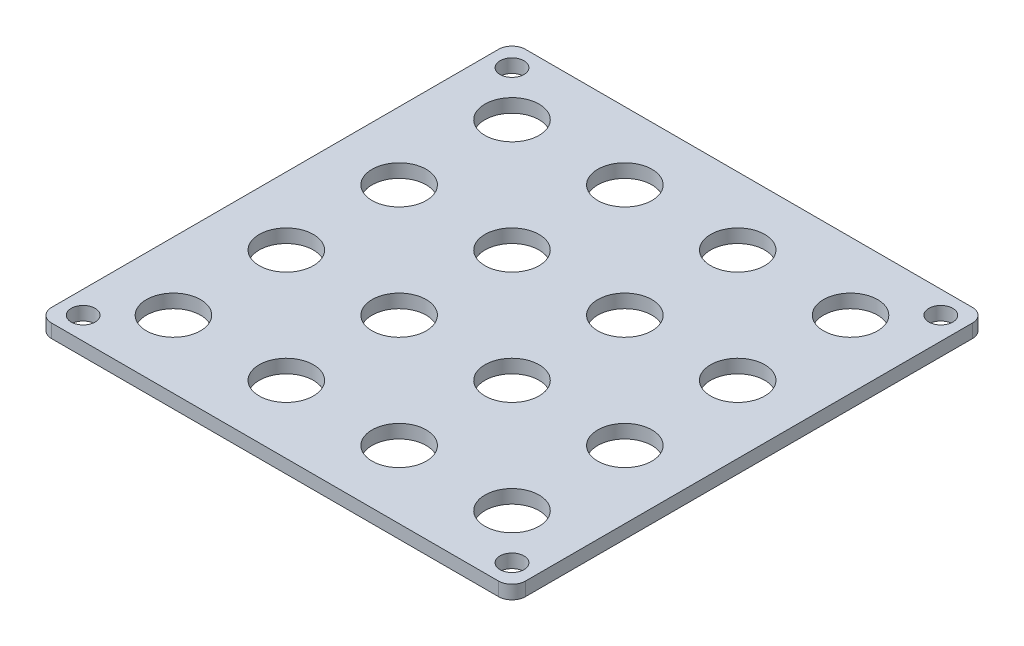
ISO-10303-21;
HEADER;
FILE_DESCRIPTION(('STEP AP214'),'2;1');
FILE_NAME('part.step','',(''),(''),'','','');
FILE_SCHEMA(('AUTOMOTIVE_DESIGN { 1 0 10303 214 1 1 1 1 }'));
ENDSEC;
DATA;
#1=APPLICATION_CONTEXT('core data for automotive mechanical design processes');
#2=APPLICATION_PROTOCOL_DEFINITION('international standard','automotive_design',2000,#1);
#3=PRODUCT_CONTEXT('',#1,'mechanical');
#4=PRODUCT('Part','Part','',(#3));
#5=PRODUCT_RELATED_PRODUCT_CATEGORY('part','',(#4));
#6=PRODUCT_DEFINITION_FORMATION('','',#4);
#7=PRODUCT_DEFINITION_CONTEXT('part definition',#1,'design');
#8=PRODUCT_DEFINITION('design','',#6,#7);
#9=PRODUCT_DEFINITION_SHAPE('','',#8);
#10=(LENGTH_UNIT() NAMED_UNIT(*) SI_UNIT(.MILLI.,.METRE.));
#11=(NAMED_UNIT(*) PLANE_ANGLE_UNIT() SI_UNIT($,.RADIAN.));
#12=(NAMED_UNIT(*) SI_UNIT($,.STERADIAN.) SOLID_ANGLE_UNIT());
#13=UNCERTAINTY_MEASURE_WITH_UNIT(LENGTH_MEASURE(1.E-05),#10,'distance_accuracy_value','');
#14=(GEOMETRIC_REPRESENTATION_CONTEXT(3) GLOBAL_UNCERTAINTY_ASSIGNED_CONTEXT((#13)) GLOBAL_UNIT_ASSIGNED_CONTEXT((#10,
#11,#12)) REPRESENTATION_CONTEXT('',''));
#15=CARTESIAN_POINT('',(0.,0.,0.));
#16=DIRECTION('',(0.,0.,1.));
#17=DIRECTION('',(1.,0.,0.));
#18=AXIS2_PLACEMENT_3D('',#15,#16,#17);
#19=CARTESIAN_POINT('',(0.,3.,0.));
#20=DIRECTION('',(0.,1.,0.));
#21=DIRECTION('',(0.,0.,1.));
#22=AXIS2_PLACEMENT_3D('',#19,#20,#21);
#23=PLANE('',#22);
#24=CARTESIAN_POINT('',(-10.,3.,-10.));
#25=DIRECTION('',(0.,1.,0.));
#26=DIRECTION('',(0.,0.,1.));
#27=AXIS2_PLACEMENT_3D('',#24,#25,#26);
#28=CIRCLE('',#27,2.64999999999999);
#29=CARTESIAN_POINT('',(-10.,3.,-7.35000000000001));
#30=VERTEX_POINT('',#29);
#31=EDGE_CURVE('E296',#30,#30,#28,.T.);
#32=ORIENTED_EDGE('',*,*,#31,.F.);
#33=EDGE_LOOP('',(#32));
#34=FACE_BOUND('',#33,.T.);
#35=CARTESIAN_POINT('',(-10.,3.,85.));
#36=DIRECTION('',(0.,1.,0.));
#37=DIRECTION('',(0.,0.,1.));
#38=AXIS2_PLACEMENT_3D('',#35,#36,#37);
#39=CIRCLE('',#38,2.64999999999999);
#40=CARTESIAN_POINT('',(-10.,3.,87.65));
#41=VERTEX_POINT('',#40);
#42=EDGE_CURVE('E290',#41,#41,#39,.T.);
#43=ORIENTED_EDGE('',*,*,#42,.F.);
#44=EDGE_LOOP('',(#43));
#45=FACE_BOUND('',#44,.T.);
#46=CARTESIAN_POINT('',(85.,3.,85.));
#47=DIRECTION('',(0.,1.,0.));
#48=DIRECTION('',(0.,0.,1.));
#49=AXIS2_PLACEMENT_3D('',#46,#47,#48);
#50=CIRCLE('',#49,2.64999999999999);
#51=CARTESIAN_POINT('',(85.,3.,87.65));
#52=VERTEX_POINT('',#51);
#53=EDGE_CURVE('E284',#52,#52,#50,.T.);
#54=ORIENTED_EDGE('',*,*,#53,.F.);
#55=EDGE_LOOP('',(#54));
#56=FACE_BOUND('',#55,.T.);
#57=CARTESIAN_POINT('',(85.,3.,-10.));
#58=DIRECTION('',(0.,1.,0.));
#59=DIRECTION('',(0.,0.,1.));
#60=AXIS2_PLACEMENT_3D('',#57,#58,#59);
#61=CIRCLE('',#60,2.64999999999999);
#62=CARTESIAN_POINT('',(85.,3.,-7.35000000000001));
#63=VERTEX_POINT('',#62);
#64=EDGE_CURVE('E278',#63,#63,#61,.T.);
#65=ORIENTED_EDGE('',*,*,#64,.F.);
#66=EDGE_LOOP('',(#65));
#67=FACE_BOUND('',#66,.T.);
#68=CARTESIAN_POINT('',(25.,3.,75.));
#69=DIRECTION('',(0.,1.,0.));
#70=DIRECTION('',(0.,0.,1.));
#71=AXIS2_PLACEMENT_3D('',#68,#69,#70);
#72=CIRCLE('',#71,6.);
#73=CARTESIAN_POINT('',(25.,3.,81.));
#74=VERTEX_POINT('',#73);
#75=EDGE_CURVE('E261',#74,#74,#72,.T.);
#76=ORIENTED_EDGE('',*,*,#75,.F.);
#77=EDGE_LOOP('',(#76));
#78=FACE_BOUND('',#77,.T.);
#79=CARTESIAN_POINT('',(0.,3.,75.));
#80=DIRECTION('',(0.,1.,0.));
#81=DIRECTION('',(0.,0.,1.));
#82=AXIS2_PLACEMENT_3D('',#79,#80,#81);
#83=CIRCLE('',#82,6.);
#84=CARTESIAN_POINT('',(0.,3.,81.));
#85=VERTEX_POINT('',#84);
#86=EDGE_CURVE('E249',#85,#85,#83,.T.);
#87=ORIENTED_EDGE('',*,*,#86,.F.);
#88=EDGE_LOOP('',(#87));
#89=FACE_BOUND('',#88,.T.);
#90=CARTESIAN_POINT('',(0.,3.,25.));
#91=DIRECTION('',(0.,1.,0.));
#92=DIRECTION('',(0.,0.,1.));
#93=AXIS2_PLACEMENT_3D('',#90,#91,#92);
#94=CIRCLE('',#93,6.);
#95=CARTESIAN_POINT('',(0.,3.,31.));
#96=VERTEX_POINT('',#95);
#97=EDGE_CURVE('E237',#96,#96,#94,.T.);
#98=ORIENTED_EDGE('',*,*,#97,.F.);
#99=EDGE_LOOP('',(#98));
#100=FACE_BOUND('',#99,.T.);
#101=CARTESIAN_POINT('',(50.,3.,50.));
#102=DIRECTION('',(0.,1.,0.));
#103=DIRECTION('',(0.,0.,1.));
#104=AXIS2_PLACEMENT_3D('',#101,#102,#103);
#105=CIRCLE('',#104,6.);
#106=CARTESIAN_POINT('',(50.,3.,56.));
#107=VERTEX_POINT('',#106);
#108=EDGE_CURVE('E225',#107,#107,#105,.T.);
#109=ORIENTED_EDGE('',*,*,#108,.F.);
#110=EDGE_LOOP('',(#109));
#111=FACE_BOUND('',#110,.T.);
#112=CARTESIAN_POINT('',(75.,3.,25.));
#113=DIRECTION('',(0.,1.,0.));
#114=DIRECTION('',(0.,0.,1.));
#115=AXIS2_PLACEMENT_3D('',#112,#113,#114);
#116=CIRCLE('',#115,6.);
#117=CARTESIAN_POINT('',(75.,3.,31.));
#118=VERTEX_POINT('',#117);
#119=EDGE_CURVE('E213',#118,#118,#116,.T.);
#120=ORIENTED_EDGE('',*,*,#119,.F.);
#121=EDGE_LOOP('',(#120));
#122=FACE_BOUND('',#121,.T.);
#123=CARTESIAN_POINT('',(25.,3.,25.));
#124=DIRECTION('',(0.,1.,0.));
#125=DIRECTION('',(0.,0.,1.));
#126=AXIS2_PLACEMENT_3D('',#123,#124,#125);
#127=CIRCLE('',#126,6.);
#128=CARTESIAN_POINT('',(25.,3.,31.));
#129=VERTEX_POINT('',#128);
#130=EDGE_CURVE('E201',#129,#129,#127,.T.);
#131=ORIENTED_EDGE('',*,*,#130,.F.);
#132=EDGE_LOOP('',(#131));
#133=FACE_BOUND('',#132,.T.);
#134=CARTESIAN_POINT('',(50.,3.,0.));
#135=DIRECTION('',(0.,1.,0.));
#136=DIRECTION('',(0.,0.,1.));
#137=AXIS2_PLACEMENT_3D('',#134,#135,#136);
#138=CIRCLE('',#137,6.);
#139=CARTESIAN_POINT('',(50.,3.,6.));
#140=VERTEX_POINT('',#139);
#141=EDGE_CURVE('E189',#140,#140,#138,.T.);
#142=ORIENTED_EDGE('',*,*,#141,.F.);
#143=EDGE_LOOP('',(#142));
#144=FACE_BOUND('',#143,.T.);
#145=CARTESIAN_POINT('',(0.,3.,0.));
#146=DIRECTION('',(0.,1.,0.));
#147=DIRECTION('',(0.,0.,1.));
#148=AXIS2_PLACEMENT_3D('',#145,#146,#147);
#149=CIRCLE('',#148,6.);
#150=CARTESIAN_POINT('',(0.,3.,6.));
#151=VERTEX_POINT('',#150);
#152=EDGE_CURVE('E130',#151,#151,#149,.T.);
#153=ORIENTED_EDGE('',*,*,#152,.F.);
#154=EDGE_LOOP('',(#153));
#155=FACE_BOUND('',#154,.T.);
#156=DIRECTION('',(-1.,0.,0.));
#157=VECTOR('',#156,1.);
#158=CARTESIAN_POINT('',(90.,3.,-15.));
#159=LINE('',#158,#157);
#160=CARTESIAN_POINT('',(87.,3.,-15.));
#161=VERTEX_POINT('',#160);
#162=CARTESIAN_POINT('',(-12.,3.,-15.));
#163=VERTEX_POINT('',#162);
#164=EDGE_CURVE('E139',#161,#163,#159,.T.);
#165=ORIENTED_EDGE('',*,*,#164,.T.);
#166=CARTESIAN_POINT('',(-12.,3.,-12.));
#167=DIRECTION('',(0.,1.,0.));
#168=DIRECTION('',(0.,0.,1.));
#169=AXIS2_PLACEMENT_3D('',#166,#167,#168);
#170=CIRCLE('',#169,3.);
#171=CARTESIAN_POINT('',(-15.,3.,-12.));
#172=VERTEX_POINT('',#171);
#173=EDGE_CURVE('E158',#163,#172,#170,.T.);
#174=ORIENTED_EDGE('',*,*,#173,.T.);
#175=DIRECTION('',(0.,0.,1.));
#176=VECTOR('',#175,1.);
#177=CARTESIAN_POINT('',(-15.,3.,90.));
#178=LINE('',#177,#176);
#179=CARTESIAN_POINT('',(-15.,3.,87.));
#180=VERTEX_POINT('',#179);
#181=EDGE_CURVE('E122',#172,#180,#178,.T.);
#182=ORIENTED_EDGE('',*,*,#181,.T.);
#183=CARTESIAN_POINT('',(-12.,3.,87.));
#184=DIRECTION('',(0.,1.,0.));
#185=DIRECTION('',(0.,0.,1.));
#186=AXIS2_PLACEMENT_3D('',#183,#184,#185);
#187=CIRCLE('',#186,3.);
#188=CARTESIAN_POINT('',(-12.,3.,90.));
#189=VERTEX_POINT('',#188);
#190=EDGE_CURVE('E153',#180,#189,#187,.T.);
#191=ORIENTED_EDGE('',*,*,#190,.T.);
#192=DIRECTION('',(1.,0.,0.));
#193=VECTOR('',#192,1.);
#194=CARTESIAN_POINT('',(90.,3.,90.));
#195=LINE('',#194,#193);
#196=CARTESIAN_POINT('',(87.,3.,90.));
#197=VERTEX_POINT('',#196);
#198=EDGE_CURVE('E169',#189,#197,#195,.T.);
#199=ORIENTED_EDGE('',*,*,#198,.T.);
#200=CARTESIAN_POINT('',(87.,3.,87.));
#201=DIRECTION('',(0.,1.,0.));
#202=DIRECTION('',(0.,0.,1.));
#203=AXIS2_PLACEMENT_3D('',#200,#201,#202);
#204=CIRCLE('',#203,3.);
#205=CARTESIAN_POINT('',(90.,3.,87.));
#206=VERTEX_POINT('',#205);
#207=EDGE_CURVE('E58',#197,#206,#204,.T.);
#208=ORIENTED_EDGE('',*,*,#207,.T.);
#209=DIRECTION('',(0.,0.,-1.));
#210=VECTOR('',#209,1.);
#211=CARTESIAN_POINT('',(90.,3.,90.));
#212=LINE('',#211,#210);
#213=CARTESIAN_POINT('',(90.,3.,-12.));
#214=VERTEX_POINT('',#213);
#215=EDGE_CURVE('E177',#206,#214,#212,.T.);
#216=ORIENTED_EDGE('',*,*,#215,.T.);
#217=CARTESIAN_POINT('',(87.,3.,-12.));
#218=DIRECTION('',(0.,1.,0.));
#219=DIRECTION('',(0.,0.,1.));
#220=AXIS2_PLACEMENT_3D('',#217,#218,#219);
#221=CIRCLE('',#220,3.);
#222=EDGE_CURVE('E156',#214,#161,#221,.T.);
#223=ORIENTED_EDGE('',*,*,#222,.T.);
#224=EDGE_LOOP('',(#165,#174,#182,#191,#199,#208,#216,#223));
#225=FACE_BOUND('',#224,.T.);
#226=CARTESIAN_POINT('',(25.,3.,0.));
#227=DIRECTION('',(0.,1.,0.));
#228=DIRECTION('',(0.,0.,1.));
#229=AXIS2_PLACEMENT_3D('',#226,#227,#228);
#230=CIRCLE('',#229,6.);
#231=CARTESIAN_POINT('',(25.,3.,6.));
#232=VERTEX_POINT('',#231);
#233=EDGE_CURVE('E184',#232,#232,#230,.T.);
#234=ORIENTED_EDGE('',*,*,#233,.F.);
#235=EDGE_LOOP('',(#234));
#236=FACE_BOUND('',#235,.T.);
#237=CARTESIAN_POINT('',(75.,3.,0.));
#238=DIRECTION('',(0.,1.,0.));
#239=DIRECTION('',(0.,0.,1.));
#240=AXIS2_PLACEMENT_3D('',#237,#238,#239);
#241=CIRCLE('',#240,6.);
#242=CARTESIAN_POINT('',(75.,3.,6.));
#243=VERTEX_POINT('',#242);
#244=EDGE_CURVE('E195',#243,#243,#241,.T.);
#245=ORIENTED_EDGE('',*,*,#244,.F.);
#246=EDGE_LOOP('',(#245));
#247=FACE_BOUND('',#246,.T.);
#248=CARTESIAN_POINT('',(50.,3.,25.));
#249=DIRECTION('',(0.,1.,0.));
#250=DIRECTION('',(0.,0.,1.));
#251=AXIS2_PLACEMENT_3D('',#248,#249,#250);
#252=CIRCLE('',#251,6.);
#253=CARTESIAN_POINT('',(50.,3.,31.));
#254=VERTEX_POINT('',#253);
#255=EDGE_CURVE('E207',#254,#254,#252,.T.);
#256=ORIENTED_EDGE('',*,*,#255,.F.);
#257=EDGE_LOOP('',(#256));
#258=FACE_BOUND('',#257,.T.);
#259=CARTESIAN_POINT('',(25.,3.,50.));
#260=DIRECTION('',(0.,1.,0.));
#261=DIRECTION('',(0.,0.,1.));
#262=AXIS2_PLACEMENT_3D('',#259,#260,#261);
#263=CIRCLE('',#262,6.);
#264=CARTESIAN_POINT('',(25.,3.,56.));
#265=VERTEX_POINT('',#264);
#266=EDGE_CURVE('E219',#265,#265,#263,.T.);
#267=ORIENTED_EDGE('',*,*,#266,.F.);
#268=EDGE_LOOP('',(#267));
#269=FACE_BOUND('',#268,.T.);
#270=CARTESIAN_POINT('',(75.,3.,50.));
#271=DIRECTION('',(0.,1.,0.));
#272=DIRECTION('',(0.,0.,1.));
#273=AXIS2_PLACEMENT_3D('',#270,#271,#272);
#274=CIRCLE('',#273,6.);
#275=CARTESIAN_POINT('',(75.,3.,56.));
#276=VERTEX_POINT('',#275);
#277=EDGE_CURVE('E231',#276,#276,#274,.T.);
#278=ORIENTED_EDGE('',*,*,#277,.F.);
#279=EDGE_LOOP('',(#278));
#280=FACE_BOUND('',#279,.T.);
#281=CARTESIAN_POINT('',(0.,3.,50.));
#282=DIRECTION('',(0.,1.,0.));
#283=DIRECTION('',(0.,0.,1.));
#284=AXIS2_PLACEMENT_3D('',#281,#282,#283);
#285=CIRCLE('',#284,6.);
#286=CARTESIAN_POINT('',(0.,3.,56.));
#287=VERTEX_POINT('',#286);
#288=EDGE_CURVE('E243',#287,#287,#285,.T.);
#289=ORIENTED_EDGE('',*,*,#288,.F.);
#290=EDGE_LOOP('',(#289));
#291=FACE_BOUND('',#290,.T.);
#292=CARTESIAN_POINT('',(75.,3.,75.));
#293=DIRECTION('',(0.,1.,0.));
#294=DIRECTION('',(0.,0.,1.));
#295=AXIS2_PLACEMENT_3D('',#292,#293,#294);
#296=CIRCLE('',#295,6.);
#297=CARTESIAN_POINT('',(75.,3.,81.));
#298=VERTEX_POINT('',#297);
#299=EDGE_CURVE('E255',#298,#298,#296,.T.);
#300=ORIENTED_EDGE('',*,*,#299,.F.);
#301=EDGE_LOOP('',(#300));
#302=FACE_BOUND('',#301,.T.);
#303=CARTESIAN_POINT('',(50.,3.,75.));
#304=DIRECTION('',(0.,1.,0.));
#305=DIRECTION('',(0.,0.,1.));
#306=AXIS2_PLACEMENT_3D('',#303,#304,#305);
#307=CIRCLE('',#306,6.);
#308=CARTESIAN_POINT('',(50.,3.,81.));
#309=VERTEX_POINT('',#308);
#310=EDGE_CURVE('E267',#309,#309,#307,.T.);
#311=ORIENTED_EDGE('',*,*,#310,.F.);
#312=EDGE_LOOP('',(#311));
#313=FACE_BOUND('',#312,.T.);
#314=ADVANCED_FACE('F36',(#34,#45,#56,#67,#78,#89,#100,#111,#122,#133,#144,#155,#225,#236,#247,
#258,#269,#280,#291,#302,#313),#23,.T.);
#315=CARTESIAN_POINT('',(0.,0.,0.));
#316=DIRECTION('',(0.,1.,0.));
#317=DIRECTION('',(0.,0.,1.));
#318=AXIS2_PLACEMENT_3D('',#315,#316,#317);
#319=PLANE('',#318);
#320=CARTESIAN_POINT('',(-10.,0.,-10.));
#321=DIRECTION('',(0.,1.,0.));
#322=DIRECTION('',(0.,0.,1.));
#323=AXIS2_PLACEMENT_3D('',#320,#321,#322);
#324=CIRCLE('',#323,2.64999999999999);
#325=CARTESIAN_POINT('',(-10.,0.,-7.35));
#326=VERTEX_POINT('',#325);
#327=EDGE_CURVE('E293',#326,#326,#324,.T.);
#328=ORIENTED_EDGE('',*,*,#327,.T.);
#329=EDGE_LOOP('',(#328));
#330=FACE_BOUND('',#329,.T.);
#331=CARTESIAN_POINT('',(-10.,0.,85.));
#332=DIRECTION('',(0.,1.,0.));
#333=DIRECTION('',(0.,0.,1.));
#334=AXIS2_PLACEMENT_3D('',#331,#332,#333);
#335=CIRCLE('',#334,2.64999999999999);
#336=CARTESIAN_POINT('',(-10.,0.,87.65));
#337=VERTEX_POINT('',#336);
#338=EDGE_CURVE('E287',#337,#337,#335,.T.);
#339=ORIENTED_EDGE('',*,*,#338,.T.);
#340=EDGE_LOOP('',(#339));
#341=FACE_BOUND('',#340,.T.);
#342=CARTESIAN_POINT('',(85.,0.,85.));
#343=DIRECTION('',(0.,1.,0.));
#344=DIRECTION('',(0.,0.,1.));
#345=AXIS2_PLACEMENT_3D('',#342,#343,#344);
#346=CIRCLE('',#345,2.64999999999999);
#347=CARTESIAN_POINT('',(85.,0.,87.65));
#348=VERTEX_POINT('',#347);
#349=EDGE_CURVE('E281',#348,#348,#346,.T.);
#350=ORIENTED_EDGE('',*,*,#349,.T.);
#351=EDGE_LOOP('',(#350));
#352=FACE_BOUND('',#351,.T.);
#353=CARTESIAN_POINT('',(85.,0.,-10.));
#354=DIRECTION('',(0.,1.,0.));
#355=DIRECTION('',(0.,0.,1.));
#356=AXIS2_PLACEMENT_3D('',#353,#354,#355);
#357=CIRCLE('',#356,2.64999999999999);
#358=CARTESIAN_POINT('',(85.,0.,-7.35000000000001));
#359=VERTEX_POINT('',#358);
#360=EDGE_CURVE('E273',#359,#359,#357,.T.);
#361=ORIENTED_EDGE('',*,*,#360,.T.);
#362=EDGE_LOOP('',(#361));
#363=FACE_BOUND('',#362,.T.);
#364=DIRECTION('',(0.,0.,1.));
#365=VECTOR('',#364,1.);
#366=CARTESIAN_POINT('',(-15.,0.,90.));
#367=LINE('',#366,#365);
#368=CARTESIAN_POINT('',(-15.,0.,-12.));
#369=VERTEX_POINT('',#368);
#370=CARTESIAN_POINT('',(-15.,0.,87.));
#371=VERTEX_POINT('',#370);
#372=EDGE_CURVE('E119',#369,#371,#367,.T.);
#373=ORIENTED_EDGE('',*,*,#372,.F.);
#374=CARTESIAN_POINT('',(-12.,0.,-12.));
#375=DIRECTION('',(0.,1.,0.));
#376=DIRECTION('',(0.,0.,1.));
#377=AXIS2_PLACEMENT_3D('',#374,#375,#376);
#378=CIRCLE('',#377,3.);
#379=CARTESIAN_POINT('',(-12.,0.,-15.));
#380=VERTEX_POINT('',#379);
#381=EDGE_CURVE('E102',#369,#380,#378,.F.);
#382=ORIENTED_EDGE('',*,*,#381,.T.);
#383=DIRECTION('',(-1.,0.,0.));
#384=VECTOR('',#383,1.);
#385=CARTESIAN_POINT('',(90.,0.,-15.));
#386=LINE('',#385,#384);
#387=CARTESIAN_POINT('',(87.,0.,-15.));
#388=VERTEX_POINT('',#387);
#389=EDGE_CURVE('E143',#388,#380,#386,.T.);
#390=ORIENTED_EDGE('',*,*,#389,.F.);
#391=CARTESIAN_POINT('',(87.,0.,-12.));
#392=DIRECTION('',(0.,1.,0.));
#393=DIRECTION('',(0.,0.,1.));
#394=AXIS2_PLACEMENT_3D('',#391,#392,#393);
#395=CIRCLE('',#394,3.);
#396=CARTESIAN_POINT('',(90.,0.,-12.));
#397=VERTEX_POINT('',#396);
#398=EDGE_CURVE('E113',#388,#397,#395,.F.);
#399=ORIENTED_EDGE('',*,*,#398,.T.);
#400=DIRECTION('',(0.,0.,-1.));
#401=VECTOR('',#400,1.);
#402=CARTESIAN_POINT('',(90.,0.,90.));
#403=LINE('',#402,#401);
#404=CARTESIAN_POINT('',(90.,0.,87.));
#405=VERTEX_POINT('',#404);
#406=EDGE_CURVE('E133',#405,#397,#403,.T.);
#407=ORIENTED_EDGE('',*,*,#406,.F.);
#408=CARTESIAN_POINT('',(87.,0.,87.));
#409=DIRECTION('',(0.,1.,0.));
#410=DIRECTION('',(0.,0.,1.));
#411=AXIS2_PLACEMENT_3D('',#408,#409,#410);
#412=CIRCLE('',#411,3.);
#413=CARTESIAN_POINT('',(87.,0.,90.));
#414=VERTEX_POINT('',#413);
#415=EDGE_CURVE('E147',#405,#414,#412,.F.);
#416=ORIENTED_EDGE('',*,*,#415,.T.);
#417=DIRECTION('',(1.,0.,0.));
#418=VECTOR('',#417,1.);
#419=CARTESIAN_POINT('',(90.,0.,90.));
#420=LINE('',#419,#418);
#421=CARTESIAN_POINT('',(-12.,0.,90.));
#422=VERTEX_POINT('',#421);
#423=EDGE_CURVE('E129',#422,#414,#420,.T.);
#424=ORIENTED_EDGE('',*,*,#423,.F.);
#425=CARTESIAN_POINT('',(-12.,0.,87.));
#426=DIRECTION('',(0.,1.,0.));
#427=DIRECTION('',(0.,0.,1.));
#428=AXIS2_PLACEMENT_3D('',#425,#426,#427);
#429=CIRCLE('',#428,3.);
#430=EDGE_CURVE('E123',#422,#371,#429,.F.);
#431=ORIENTED_EDGE('',*,*,#430,.T.);
#432=EDGE_LOOP('',(#373,#382,#390,#399,#407,#416,#424,#431));
#433=FACE_BOUND('',#432,.T.);
#434=CARTESIAN_POINT('',(0.,0.,0.));
#435=DIRECTION('',(0.,1.,0.));
#436=DIRECTION('',(0.,0.,1.));
#437=AXIS2_PLACEMENT_3D('',#434,#435,#436);
#438=CIRCLE('',#437,6.);
#439=CARTESIAN_POINT('',(0.,0.,6.));
#440=VERTEX_POINT('',#439);
#441=EDGE_CURVE('E136',#440,#440,#438,.T.);
#442=ORIENTED_EDGE('',*,*,#441,.T.);
#443=EDGE_LOOP('',(#442));
#444=FACE_BOUND('',#443,.T.);
#445=CARTESIAN_POINT('',(25.,0.,0.));
#446=DIRECTION('',(0.,1.,0.));
#447=DIRECTION('',(0.,0.,1.));
#448=AXIS2_PLACEMENT_3D('',#445,#446,#447);
#449=CIRCLE('',#448,6.);
#450=CARTESIAN_POINT('',(25.,0.,6.));
#451=VERTEX_POINT('',#450);
#452=EDGE_CURVE('E186',#451,#451,#449,.T.);
#453=ORIENTED_EDGE('',*,*,#452,.T.);
#454=EDGE_LOOP('',(#453));
#455=FACE_BOUND('',#454,.T.);
#456=CARTESIAN_POINT('',(50.,0.,0.));
#457=DIRECTION('',(0.,1.,0.));
#458=DIRECTION('',(0.,0.,1.));
#459=AXIS2_PLACEMENT_3D('',#456,#457,#458);
#460=CIRCLE('',#459,6.);
#461=CARTESIAN_POINT('',(50.,0.,6.));
#462=VERTEX_POINT('',#461);
#463=EDGE_CURVE('E192',#462,#462,#460,.T.);
#464=ORIENTED_EDGE('',*,*,#463,.T.);
#465=EDGE_LOOP('',(#464));
#466=FACE_BOUND('',#465,.T.);
#467=CARTESIAN_POINT('',(75.,0.,0.));
#468=DIRECTION('',(0.,1.,0.));
#469=DIRECTION('',(0.,0.,1.));
#470=AXIS2_PLACEMENT_3D('',#467,#468,#469);
#471=CIRCLE('',#470,6.);
#472=CARTESIAN_POINT('',(75.,0.,6.));
#473=VERTEX_POINT('',#472);
#474=EDGE_CURVE('E198',#473,#473,#471,.T.);
#475=ORIENTED_EDGE('',*,*,#474,.T.);
#476=EDGE_LOOP('',(#475));
#477=FACE_BOUND('',#476,.T.);
#478=CARTESIAN_POINT('',(25.,0.,25.));
#479=DIRECTION('',(0.,1.,0.));
#480=DIRECTION('',(0.,0.,1.));
#481=AXIS2_PLACEMENT_3D('',#478,#479,#480);
#482=CIRCLE('',#481,6.);
#483=CARTESIAN_POINT('',(25.,0.,31.));
#484=VERTEX_POINT('',#483);
#485=EDGE_CURVE('E204',#484,#484,#482,.T.);
#486=ORIENTED_EDGE('',*,*,#485,.T.);
#487=EDGE_LOOP('',(#486));
#488=FACE_BOUND('',#487,.T.);
#489=CARTESIAN_POINT('',(50.,0.,25.));
#490=DIRECTION('',(0.,1.,0.));
#491=DIRECTION('',(0.,0.,1.));
#492=AXIS2_PLACEMENT_3D('',#489,#490,#491);
#493=CIRCLE('',#492,6.);
#494=CARTESIAN_POINT('',(50.,0.,31.));
#495=VERTEX_POINT('',#494);
#496=EDGE_CURVE('E210',#495,#495,#493,.T.);
#497=ORIENTED_EDGE('',*,*,#496,.T.);
#498=EDGE_LOOP('',(#497));
#499=FACE_BOUND('',#498,.T.);
#500=CARTESIAN_POINT('',(75.,0.,25.));
#501=DIRECTION('',(0.,1.,0.));
#502=DIRECTION('',(0.,0.,1.));
#503=AXIS2_PLACEMENT_3D('',#500,#501,#502);
#504=CIRCLE('',#503,6.);
#505=CARTESIAN_POINT('',(75.,0.,31.));
#506=VERTEX_POINT('',#505);
#507=EDGE_CURVE('E216',#506,#506,#504,.T.);
#508=ORIENTED_EDGE('',*,*,#507,.T.);
#509=EDGE_LOOP('',(#508));
#510=FACE_BOUND('',#509,.T.);
#511=CARTESIAN_POINT('',(25.,0.,50.));
#512=DIRECTION('',(0.,1.,0.));
#513=DIRECTION('',(0.,0.,1.));
#514=AXIS2_PLACEMENT_3D('',#511,#512,#513);
#515=CIRCLE('',#514,6.);
#516=CARTESIAN_POINT('',(25.,0.,56.));
#517=VERTEX_POINT('',#516);
#518=EDGE_CURVE('E222',#517,#517,#515,.T.);
#519=ORIENTED_EDGE('',*,*,#518,.T.);
#520=EDGE_LOOP('',(#519));
#521=FACE_BOUND('',#520,.T.);
#522=CARTESIAN_POINT('',(50.,0.,50.));
#523=DIRECTION('',(0.,1.,0.));
#524=DIRECTION('',(0.,0.,1.));
#525=AXIS2_PLACEMENT_3D('',#522,#523,#524);
#526=CIRCLE('',#525,6.);
#527=CARTESIAN_POINT('',(50.,0.,56.));
#528=VERTEX_POINT('',#527);
#529=EDGE_CURVE('E228',#528,#528,#526,.T.);
#530=ORIENTED_EDGE('',*,*,#529,.T.);
#531=EDGE_LOOP('',(#530));
#532=FACE_BOUND('',#531,.T.);
#533=CARTESIAN_POINT('',(75.,0.,50.));
#534=DIRECTION('',(0.,1.,0.));
#535=DIRECTION('',(0.,0.,1.));
#536=AXIS2_PLACEMENT_3D('',#533,#534,#535);
#537=CIRCLE('',#536,6.);
#538=CARTESIAN_POINT('',(75.,0.,56.));
#539=VERTEX_POINT('',#538);
#540=EDGE_CURVE('E234',#539,#539,#537,.T.);
#541=ORIENTED_EDGE('',*,*,#540,.T.);
#542=EDGE_LOOP('',(#541));
#543=FACE_BOUND('',#542,.T.);
#544=CARTESIAN_POINT('',(0.,0.,25.));
#545=DIRECTION('',(0.,1.,0.));
#546=DIRECTION('',(0.,0.,1.));
#547=AXIS2_PLACEMENT_3D('',#544,#545,#546);
#548=CIRCLE('',#547,6.);
#549=CARTESIAN_POINT('',(0.,0.,31.));
#550=VERTEX_POINT('',#549);
#551=EDGE_CURVE('E240',#550,#550,#548,.T.);
#552=ORIENTED_EDGE('',*,*,#551,.T.);
#553=EDGE_LOOP('',(#552));
#554=FACE_BOUND('',#553,.T.);
#555=CARTESIAN_POINT('',(0.,0.,50.));
#556=DIRECTION('',(0.,1.,0.));
#557=DIRECTION('',(0.,0.,1.));
#558=AXIS2_PLACEMENT_3D('',#555,#556,#557);
#559=CIRCLE('',#558,6.);
#560=CARTESIAN_POINT('',(0.,0.,56.));
#561=VERTEX_POINT('',#560);
#562=EDGE_CURVE('E246',#561,#561,#559,.T.);
#563=ORIENTED_EDGE('',*,*,#562,.T.);
#564=EDGE_LOOP('',(#563));
#565=FACE_BOUND('',#564,.T.);
#566=CARTESIAN_POINT('',(0.,0.,75.));
#567=DIRECTION('',(0.,1.,0.));
#568=DIRECTION('',(0.,0.,1.));
#569=AXIS2_PLACEMENT_3D('',#566,#567,#568);
#570=CIRCLE('',#569,6.);
#571=CARTESIAN_POINT('',(0.,0.,81.));
#572=VERTEX_POINT('',#571);
#573=EDGE_CURVE('E252',#572,#572,#570,.T.);
#574=ORIENTED_EDGE('',*,*,#573,.T.);
#575=EDGE_LOOP('',(#574));
#576=FACE_BOUND('',#575,.T.);
#577=CARTESIAN_POINT('',(75.,0.,75.));
#578=DIRECTION('',(0.,1.,0.));
#579=DIRECTION('',(0.,0.,1.));
#580=AXIS2_PLACEMENT_3D('',#577,#578,#579);
#581=CIRCLE('',#580,6.);
#582=CARTESIAN_POINT('',(75.,0.,81.));
#583=VERTEX_POINT('',#582);
#584=EDGE_CURVE('E258',#583,#583,#581,.T.);
#585=ORIENTED_EDGE('',*,*,#584,.T.);
#586=EDGE_LOOP('',(#585));
#587=FACE_BOUND('',#586,.T.);
#588=CARTESIAN_POINT('',(25.,0.,75.));
#589=DIRECTION('',(0.,1.,0.));
#590=DIRECTION('',(0.,0.,1.));
#591=AXIS2_PLACEMENT_3D('',#588,#589,#590);
#592=CIRCLE('',#591,6.);
#593=CARTESIAN_POINT('',(25.,0.,81.));
#594=VERTEX_POINT('',#593);
#595=EDGE_CURVE('E264',#594,#594,#592,.T.);
#596=ORIENTED_EDGE('',*,*,#595,.T.);
#597=EDGE_LOOP('',(#596));
#598=FACE_BOUND('',#597,.T.);
#599=CARTESIAN_POINT('',(50.,0.,75.));
#600=DIRECTION('',(0.,1.,0.));
#601=DIRECTION('',(0.,0.,1.));
#602=AXIS2_PLACEMENT_3D('',#599,#600,#601);
#603=CIRCLE('',#602,6.);
#604=CARTESIAN_POINT('',(50.,0.,81.));
#605=VERTEX_POINT('',#604);
#606=EDGE_CURVE('E270',#605,#605,#603,.T.);
#607=ORIENTED_EDGE('',*,*,#606,.T.);
#608=EDGE_LOOP('',(#607));
#609=FACE_BOUND('',#608,.T.);
#610=ADVANCED_FACE('F126',(#330,#341,#352,#363,#433,#444,#455,#466,#477,#488,#499,#510,#521,
#532,#543,#554,#565,#576,#587,#598,#609),#319,.F.);
#611=CARTESIAN_POINT('',(-15.,3.,90.));
#612=DIRECTION('',(1.,0.,0.));
#613=DIRECTION('',(0.,0.,-1.));
#614=AXIS2_PLACEMENT_3D('',#611,#612,#613);
#615=PLANE('',#614);
#616=ORIENTED_EDGE('',*,*,#181,.F.);
#617=DIRECTION('',(0.,-1.,0.));
#618=VECTOR('',#617,1.);
#619=CARTESIAN_POINT('',(-15.,3.,-12.));
#620=LINE('',#619,#618);
#621=EDGE_CURVE('E106',#172,#369,#620,.T.);
#622=ORIENTED_EDGE('',*,*,#621,.T.);
#623=ORIENTED_EDGE('',*,*,#372,.T.);
#624=DIRECTION('',(0.,-1.,0.));
#625=VECTOR('',#624,1.);
#626=CARTESIAN_POINT('',(-15.,3.,87.));
#627=LINE('',#626,#625);
#628=EDGE_CURVE('E124',#371,#180,#627,.F.);
#629=ORIENTED_EDGE('',*,*,#628,.T.);
#630=EDGE_LOOP('',(#616,#622,#623,#629));
#631=FACE_BOUND('',#630,.T.);
#632=ADVANCED_FACE('F118',(#631),#615,.F.);
#633=CARTESIAN_POINT('',(90.,3.,90.));
#634=DIRECTION('',(0.,0.,-1.));
#635=DIRECTION('',(-1.,0.,0.));
#636=AXIS2_PLACEMENT_3D('',#633,#634,#635);
#637=PLANE('',#636);
#638=ORIENTED_EDGE('',*,*,#423,.T.);
#639=DIRECTION('',(0.,-1.,0.));
#640=VECTOR('',#639,1.);
#641=CARTESIAN_POINT('',(87.,3.,90.));
#642=LINE('',#641,#640);
#643=EDGE_CURVE('E11',#414,#197,#642,.F.);
#644=ORIENTED_EDGE('',*,*,#643,.T.);
#645=ORIENTED_EDGE('',*,*,#198,.F.);
#646=DIRECTION('',(0.,-1.,0.));
#647=VECTOR('',#646,1.);
#648=CARTESIAN_POINT('',(-12.,3.,90.));
#649=LINE('',#648,#647);
#650=EDGE_CURVE('E44',#189,#422,#649,.T.);
#651=ORIENTED_EDGE('',*,*,#650,.T.);
#652=EDGE_LOOP('',(#638,#644,#645,#651));
#653=FACE_BOUND('',#652,.T.);
#654=ADVANCED_FACE('F167',(#653),#637,.F.);
#655=CARTESIAN_POINT('',(90.,3.,90.));
#656=DIRECTION('',(-1.,0.,0.));
#657=DIRECTION('',(0.,0.,1.));
#658=AXIS2_PLACEMENT_3D('',#655,#656,#657);
#659=PLANE('',#658);
#660=ORIENTED_EDGE('',*,*,#406,.T.);
#661=DIRECTION('',(0.,-1.,0.));
#662=VECTOR('',#661,1.);
#663=CARTESIAN_POINT('',(90.,3.,-12.));
#664=LINE('',#663,#662);
#665=EDGE_CURVE('E51',#397,#214,#664,.F.);
#666=ORIENTED_EDGE('',*,*,#665,.T.);
#667=ORIENTED_EDGE('',*,*,#215,.F.);
#668=DIRECTION('',(0.,-1.,0.));
#669=VECTOR('',#668,1.);
#670=CARTESIAN_POINT('',(90.,3.,87.));
#671=LINE('',#670,#669);
#672=EDGE_CURVE('E160',#206,#405,#671,.T.);
#673=ORIENTED_EDGE('',*,*,#672,.T.);
#674=EDGE_LOOP('',(#660,#666,#667,#673));
#675=FACE_BOUND('',#674,.T.);
#676=ADVANCED_FACE('F176',(#675),#659,.F.);
#677=CARTESIAN_POINT('',(90.,3.,-15.));
#678=DIRECTION('',(0.,0.,1.));
#679=DIRECTION('',(1.,0.,0.));
#680=AXIS2_PLACEMENT_3D('',#677,#678,#679);
#681=PLANE('',#680);
#682=ORIENTED_EDGE('',*,*,#389,.T.);
#683=DIRECTION('',(0.,-1.,0.));
#684=VECTOR('',#683,1.);
#685=CARTESIAN_POINT('',(-12.,3.,-15.));
#686=LINE('',#685,#684);
#687=EDGE_CURVE('E107',#380,#163,#686,.F.);
#688=ORIENTED_EDGE('',*,*,#687,.T.);
#689=ORIENTED_EDGE('',*,*,#164,.F.);
#690=DIRECTION('',(0.,-1.,0.));
#691=VECTOR('',#690,1.);
#692=CARTESIAN_POINT('',(87.,3.,-15.));
#693=LINE('',#692,#691);
#694=EDGE_CURVE('E112',#161,#388,#693,.T.);
#695=ORIENTED_EDGE('',*,*,#694,.T.);
#696=EDGE_LOOP('',(#682,#688,#689,#695));
#697=FACE_BOUND('',#696,.T.);
#698=ADVANCED_FACE('F362',(#697),#681,.F.);
#699=CARTESIAN_POINT('',(0.,3.,0.));
#700=DIRECTION('',(0.,-1.,0.));
#701=DIRECTION('',(0.,0.,-1.));
#702=AXIS2_PLACEMENT_3D('',#699,#700,#701);
#703=CYLINDRICAL_SURFACE('',#702,6.);
#704=ORIENTED_EDGE('',*,*,#152,.T.);
#705=EDGE_LOOP('',(#704));
#706=FACE_BOUND('',#705,.T.);
#707=ORIENTED_EDGE('',*,*,#441,.F.);
#708=EDGE_LOOP('',(#707));
#709=FACE_BOUND('',#708,.T.);
#710=ADVANCED_FACE('F365',(#706,#709),#703,.F.);
#711=CARTESIAN_POINT('',(25.,3.,0.));
#712=DIRECTION('',(0.,-1.,0.));
#713=DIRECTION('',(0.,0.,-1.));
#714=AXIS2_PLACEMENT_3D('',#711,#712,#713);
#715=CYLINDRICAL_SURFACE('',#714,6.);
#716=ORIENTED_EDGE('',*,*,#233,.T.);
#717=EDGE_LOOP('',(#716));
#718=FACE_BOUND('',#717,.T.);
#719=ORIENTED_EDGE('',*,*,#452,.F.);
#720=EDGE_LOOP('',(#719));
#721=FACE_BOUND('',#720,.T.);
#722=ADVANCED_FACE('F634',(#718,#721),#715,.F.);
#723=CARTESIAN_POINT('',(50.,3.,0.));
#724=DIRECTION('',(0.,-1.,0.));
#725=DIRECTION('',(0.,0.,-1.));
#726=AXIS2_PLACEMENT_3D('',#723,#724,#725);
#727=CYLINDRICAL_SURFACE('',#726,6.);
#728=ORIENTED_EDGE('',*,*,#141,.T.);
#729=EDGE_LOOP('',(#728));
#730=FACE_BOUND('',#729,.T.);
#731=ORIENTED_EDGE('',*,*,#463,.F.);
#732=EDGE_LOOP('',(#731));
#733=FACE_BOUND('',#732,.T.);
#734=ADVANCED_FACE('F623',(#730,#733),#727,.F.);
#735=CARTESIAN_POINT('',(75.,3.,0.));
#736=DIRECTION('',(0.,-1.,0.));
#737=DIRECTION('',(0.,0.,-1.));
#738=AXIS2_PLACEMENT_3D('',#735,#736,#737);
#739=CYLINDRICAL_SURFACE('',#738,6.);
#740=ORIENTED_EDGE('',*,*,#244,.T.);
#741=EDGE_LOOP('',(#740));
#742=FACE_BOUND('',#741,.T.);
#743=ORIENTED_EDGE('',*,*,#474,.F.);
#744=EDGE_LOOP('',(#743));
#745=FACE_BOUND('',#744,.T.);
#746=ADVANCED_FACE('F612',(#742,#745),#739,.F.);
#747=CARTESIAN_POINT('',(25.,3.,25.));
#748=DIRECTION('',(0.,-1.,0.));
#749=DIRECTION('',(0.,0.,-1.));
#750=AXIS2_PLACEMENT_3D('',#747,#748,#749);
#751=CYLINDRICAL_SURFACE('',#750,6.);
#752=ORIENTED_EDGE('',*,*,#130,.T.);
#753=EDGE_LOOP('',(#752));
#754=FACE_BOUND('',#753,.T.);
#755=ORIENTED_EDGE('',*,*,#485,.F.);
#756=EDGE_LOOP('',(#755));
#757=FACE_BOUND('',#756,.T.);
#758=ADVANCED_FACE('F601',(#754,#757),#751,.F.);
#759=CARTESIAN_POINT('',(50.,3.,25.));
#760=DIRECTION('',(0.,-1.,0.));
#761=DIRECTION('',(0.,0.,-1.));
#762=AXIS2_PLACEMENT_3D('',#759,#760,#761);
#763=CYLINDRICAL_SURFACE('',#762,6.);
#764=ORIENTED_EDGE('',*,*,#255,.T.);
#765=EDGE_LOOP('',(#764));
#766=FACE_BOUND('',#765,.T.);
#767=ORIENTED_EDGE('',*,*,#496,.F.);
#768=EDGE_LOOP('',(#767));
#769=FACE_BOUND('',#768,.T.);
#770=ADVANCED_FACE('F590',(#766,#769),#763,.F.);
#771=CARTESIAN_POINT('',(75.,3.,25.));
#772=DIRECTION('',(0.,-1.,0.));
#773=DIRECTION('',(0.,0.,-1.));
#774=AXIS2_PLACEMENT_3D('',#771,#772,#773);
#775=CYLINDRICAL_SURFACE('',#774,6.);
#776=ORIENTED_EDGE('',*,*,#119,.T.);
#777=EDGE_LOOP('',(#776));
#778=FACE_BOUND('',#777,.T.);
#779=ORIENTED_EDGE('',*,*,#507,.F.);
#780=EDGE_LOOP('',(#779));
#781=FACE_BOUND('',#780,.T.);
#782=ADVANCED_FACE('F579',(#778,#781),#775,.F.);
#783=CARTESIAN_POINT('',(25.,3.,50.));
#784=DIRECTION('',(0.,-1.,0.));
#785=DIRECTION('',(0.,0.,-1.));
#786=AXIS2_PLACEMENT_3D('',#783,#784,#785);
#787=CYLINDRICAL_SURFACE('',#786,6.);
#788=ORIENTED_EDGE('',*,*,#266,.T.);
#789=EDGE_LOOP('',(#788));
#790=FACE_BOUND('',#789,.T.);
#791=ORIENTED_EDGE('',*,*,#518,.F.);
#792=EDGE_LOOP('',(#791));
#793=FACE_BOUND('',#792,.T.);
#794=ADVANCED_FACE('F568',(#790,#793),#787,.F.);
#795=CARTESIAN_POINT('',(50.,3.,50.));
#796=DIRECTION('',(0.,-1.,0.));
#797=DIRECTION('',(0.,0.,-1.));
#798=AXIS2_PLACEMENT_3D('',#795,#796,#797);
#799=CYLINDRICAL_SURFACE('',#798,6.);
#800=ORIENTED_EDGE('',*,*,#108,.T.);
#801=EDGE_LOOP('',(#800));
#802=FACE_BOUND('',#801,.T.);
#803=ORIENTED_EDGE('',*,*,#529,.F.);
#804=EDGE_LOOP('',(#803));
#805=FACE_BOUND('',#804,.T.);
#806=ADVANCED_FACE('F557',(#802,#805),#799,.F.);
#807=CARTESIAN_POINT('',(75.,3.,50.));
#808=DIRECTION('',(0.,-1.,0.));
#809=DIRECTION('',(0.,0.,-1.));
#810=AXIS2_PLACEMENT_3D('',#807,#808,#809);
#811=CYLINDRICAL_SURFACE('',#810,6.);
#812=ORIENTED_EDGE('',*,*,#277,.T.);
#813=EDGE_LOOP('',(#812));
#814=FACE_BOUND('',#813,.T.);
#815=ORIENTED_EDGE('',*,*,#540,.F.);
#816=EDGE_LOOP('',(#815));
#817=FACE_BOUND('',#816,.T.);
#818=ADVANCED_FACE('F546',(#814,#817),#811,.F.);
#819=CARTESIAN_POINT('',(0.,3.,25.));
#820=DIRECTION('',(0.,-1.,0.));
#821=DIRECTION('',(0.,0.,-1.));
#822=AXIS2_PLACEMENT_3D('',#819,#820,#821);
#823=CYLINDRICAL_SURFACE('',#822,6.);
#824=ORIENTED_EDGE('',*,*,#97,.T.);
#825=EDGE_LOOP('',(#824));
#826=FACE_BOUND('',#825,.T.);
#827=ORIENTED_EDGE('',*,*,#551,.F.);
#828=EDGE_LOOP('',(#827));
#829=FACE_BOUND('',#828,.T.);
#830=ADVANCED_FACE('F535',(#826,#829),#823,.F.);
#831=CARTESIAN_POINT('',(0.,3.,50.));
#832=DIRECTION('',(0.,-1.,0.));
#833=DIRECTION('',(0.,0.,-1.));
#834=AXIS2_PLACEMENT_3D('',#831,#832,#833);
#835=CYLINDRICAL_SURFACE('',#834,6.);
#836=ORIENTED_EDGE('',*,*,#288,.T.);
#837=EDGE_LOOP('',(#836));
#838=FACE_BOUND('',#837,.T.);
#839=ORIENTED_EDGE('',*,*,#562,.F.);
#840=EDGE_LOOP('',(#839));
#841=FACE_BOUND('',#840,.T.);
#842=ADVANCED_FACE('F524',(#838,#841),#835,.F.);
#843=CARTESIAN_POINT('',(0.,3.,75.));
#844=DIRECTION('',(0.,-1.,0.));
#845=DIRECTION('',(0.,0.,-1.));
#846=AXIS2_PLACEMENT_3D('',#843,#844,#845);
#847=CYLINDRICAL_SURFACE('',#846,6.);
#848=ORIENTED_EDGE('',*,*,#86,.T.);
#849=EDGE_LOOP('',(#848));
#850=FACE_BOUND('',#849,.T.);
#851=ORIENTED_EDGE('',*,*,#573,.F.);
#852=EDGE_LOOP('',(#851));
#853=FACE_BOUND('',#852,.T.);
#854=ADVANCED_FACE('F513',(#850,#853),#847,.F.);
#855=CARTESIAN_POINT('',(75.,3.,75.));
#856=DIRECTION('',(0.,-1.,0.));
#857=DIRECTION('',(0.,0.,-1.));
#858=AXIS2_PLACEMENT_3D('',#855,#856,#857);
#859=CYLINDRICAL_SURFACE('',#858,6.);
#860=ORIENTED_EDGE('',*,*,#299,.T.);
#861=EDGE_LOOP('',(#860));
#862=FACE_BOUND('',#861,.T.);
#863=ORIENTED_EDGE('',*,*,#584,.F.);
#864=EDGE_LOOP('',(#863));
#865=FACE_BOUND('',#864,.T.);
#866=ADVANCED_FACE('F502',(#862,#865),#859,.F.);
#867=CARTESIAN_POINT('',(25.,3.,75.));
#868=DIRECTION('',(0.,-1.,0.));
#869=DIRECTION('',(0.,0.,-1.));
#870=AXIS2_PLACEMENT_3D('',#867,#868,#869);
#871=CYLINDRICAL_SURFACE('',#870,6.);
#872=ORIENTED_EDGE('',*,*,#75,.T.);
#873=EDGE_LOOP('',(#872));
#874=FACE_BOUND('',#873,.T.);
#875=ORIENTED_EDGE('',*,*,#595,.F.);
#876=EDGE_LOOP('',(#875));
#877=FACE_BOUND('',#876,.T.);
#878=ADVANCED_FACE('F348',(#874,#877),#871,.F.);
#879=CARTESIAN_POINT('',(50.,3.,75.));
#880=DIRECTION('',(0.,-1.,0.));
#881=DIRECTION('',(0.,0.,-1.));
#882=AXIS2_PLACEMENT_3D('',#879,#880,#881);
#883=CYLINDRICAL_SURFACE('',#882,6.);
#884=ORIENTED_EDGE('',*,*,#310,.T.);
#885=EDGE_LOOP('',(#884));
#886=FACE_BOUND('',#885,.T.);
#887=ORIENTED_EDGE('',*,*,#606,.F.);
#888=EDGE_LOOP('',(#887));
#889=FACE_BOUND('',#888,.T.);
#890=ADVANCED_FACE('F344',(#886,#889),#883,.F.);
#891=CARTESIAN_POINT('',(85.,3.,-10.));
#892=DIRECTION('',(0.,1.,0.));
#893=DIRECTION('',(0.,0.,1.));
#894=AXIS2_PLACEMENT_3D('',#891,#892,#893);
#895=CYLINDRICAL_SURFACE('',#894,2.64999999999999);
#896=ORIENTED_EDGE('',*,*,#360,.F.);
#897=EDGE_LOOP('',(#896));
#898=FACE_BOUND('',#897,.T.);
#899=ORIENTED_EDGE('',*,*,#64,.T.);
#900=EDGE_LOOP('',(#899));
#901=FACE_BOUND('',#900,.T.);
#902=ADVANCED_FACE('F347',(#898,#901),#895,.F.);
#903=CARTESIAN_POINT('',(85.,3.,85.));
#904=DIRECTION('',(0.,1.,0.));
#905=DIRECTION('',(0.,0.,1.));
#906=AXIS2_PLACEMENT_3D('',#903,#904,#905);
#907=CYLINDRICAL_SURFACE('',#906,2.64999999999999);
#908=ORIENTED_EDGE('',*,*,#349,.F.);
#909=EDGE_LOOP('',(#908));
#910=FACE_BOUND('',#909,.T.);
#911=ORIENTED_EDGE('',*,*,#53,.T.);
#912=EDGE_LOOP('',(#911));
#913=FACE_BOUND('',#912,.T.);
#914=ADVANCED_FACE('F464',(#910,#913),#907,.F.);
#915=CARTESIAN_POINT('',(-10.,3.,85.));
#916=DIRECTION('',(0.,1.,0.));
#917=DIRECTION('',(0.,0.,1.));
#918=AXIS2_PLACEMENT_3D('',#915,#916,#917);
#919=CYLINDRICAL_SURFACE('',#918,2.64999999999999);
#920=ORIENTED_EDGE('',*,*,#338,.F.);
#921=EDGE_LOOP('',(#920));
#922=FACE_BOUND('',#921,.T.);
#923=ORIENTED_EDGE('',*,*,#42,.T.);
#924=EDGE_LOOP('',(#923));
#925=FACE_BOUND('',#924,.T.);
#926=ADVANCED_FACE('F453',(#922,#925),#919,.F.);
#927=CARTESIAN_POINT('',(-10.,3.,-10.));
#928=DIRECTION('',(0.,1.,0.));
#929=DIRECTION('',(0.,0.,1.));
#930=AXIS2_PLACEMENT_3D('',#927,#928,#929);
#931=CYLINDRICAL_SURFACE('',#930,2.64999999999999);
#932=ORIENTED_EDGE('',*,*,#327,.F.);
#933=EDGE_LOOP('',(#932));
#934=FACE_BOUND('',#933,.T.);
#935=ORIENTED_EDGE('',*,*,#31,.T.);
#936=EDGE_LOOP('',(#935));
#937=FACE_BOUND('',#936,.T.);
#938=ADVANCED_FACE('F300',(#934,#937),#931,.F.);
#939=CARTESIAN_POINT('',(-12.,3.,-12.));
#940=DIRECTION('',(0.,-1.,0.));
#941=DIRECTION('',(0.,0.,-1.));
#942=AXIS2_PLACEMENT_3D('',#939,#940,#941);
#943=CYLINDRICAL_SURFACE('',#942,3.);
#944=ORIENTED_EDGE('',*,*,#173,.F.);
#945=ORIENTED_EDGE('',*,*,#687,.F.);
#946=ORIENTED_EDGE('',*,*,#381,.F.);
#947=ORIENTED_EDGE('',*,*,#621,.F.);
#948=EDGE_LOOP('',(#944,#945,#946,#947));
#949=FACE_BOUND('',#948,.T.);
#950=ADVANCED_FACE('F105',(#949),#943,.T.);
#951=CARTESIAN_POINT('',(87.,3.,-12.));
#952=DIRECTION('',(0.,-1.,0.));
#953=DIRECTION('',(0.,0.,-1.));
#954=AXIS2_PLACEMENT_3D('',#951,#952,#953);
#955=CYLINDRICAL_SURFACE('',#954,3.);
#956=ORIENTED_EDGE('',*,*,#222,.F.);
#957=ORIENTED_EDGE('',*,*,#665,.F.);
#958=ORIENTED_EDGE('',*,*,#398,.F.);
#959=ORIENTED_EDGE('',*,*,#694,.F.);
#960=EDGE_LOOP('',(#956,#957,#958,#959));
#961=FACE_BOUND('',#960,.T.);
#962=ADVANCED_FACE('F373',(#961),#955,.T.);
#963=CARTESIAN_POINT('',(87.,3.,87.));
#964=DIRECTION('',(0.,-1.,0.));
#965=DIRECTION('',(0.,0.,-1.));
#966=AXIS2_PLACEMENT_3D('',#963,#964,#965);
#967=CYLINDRICAL_SURFACE('',#966,3.);
#968=ORIENTED_EDGE('',*,*,#207,.F.);
#969=ORIENTED_EDGE('',*,*,#643,.F.);
#970=ORIENTED_EDGE('',*,*,#415,.F.);
#971=ORIENTED_EDGE('',*,*,#672,.F.);
#972=EDGE_LOOP('',(#968,#969,#970,#971));
#973=FACE_BOUND('',#972,.T.);
#974=ADVANCED_FACE('F175',(#973),#967,.T.);
#975=CARTESIAN_POINT('',(-12.,3.,87.));
#976=DIRECTION('',(0.,-1.,0.));
#977=DIRECTION('',(0.,0.,-1.));
#978=AXIS2_PLACEMENT_3D('',#975,#976,#977);
#979=CYLINDRICAL_SURFACE('',#978,3.);
#980=ORIENTED_EDGE('',*,*,#190,.F.);
#981=ORIENTED_EDGE('',*,*,#628,.F.);
#982=ORIENTED_EDGE('',*,*,#430,.F.);
#983=ORIENTED_EDGE('',*,*,#650,.F.);
#984=EDGE_LOOP('',(#980,#981,#982,#983));
#985=FACE_BOUND('',#984,.T.);
#986=ADVANCED_FACE('F38',(#985),#979,.T.);
#987=CLOSED_SHELL('',(#314,#610,#632,#654,#676,#698,#710,#722,#734,#746,#758,#770,#782,#794,
#806,#818,#830,#842,#854,#866,#878,#890,#902,#914,#926,#938,#950,#962,#974,#986));
#988=MANIFOLD_SOLID_BREP('B2',#987);
#989=ADVANCED_BREP_SHAPE_REPRESENTATION('',(#18,#988),#14);
#990=SHAPE_DEFINITION_REPRESENTATION(#9,#989);
ENDSEC;
END-ISO-10303-21;
